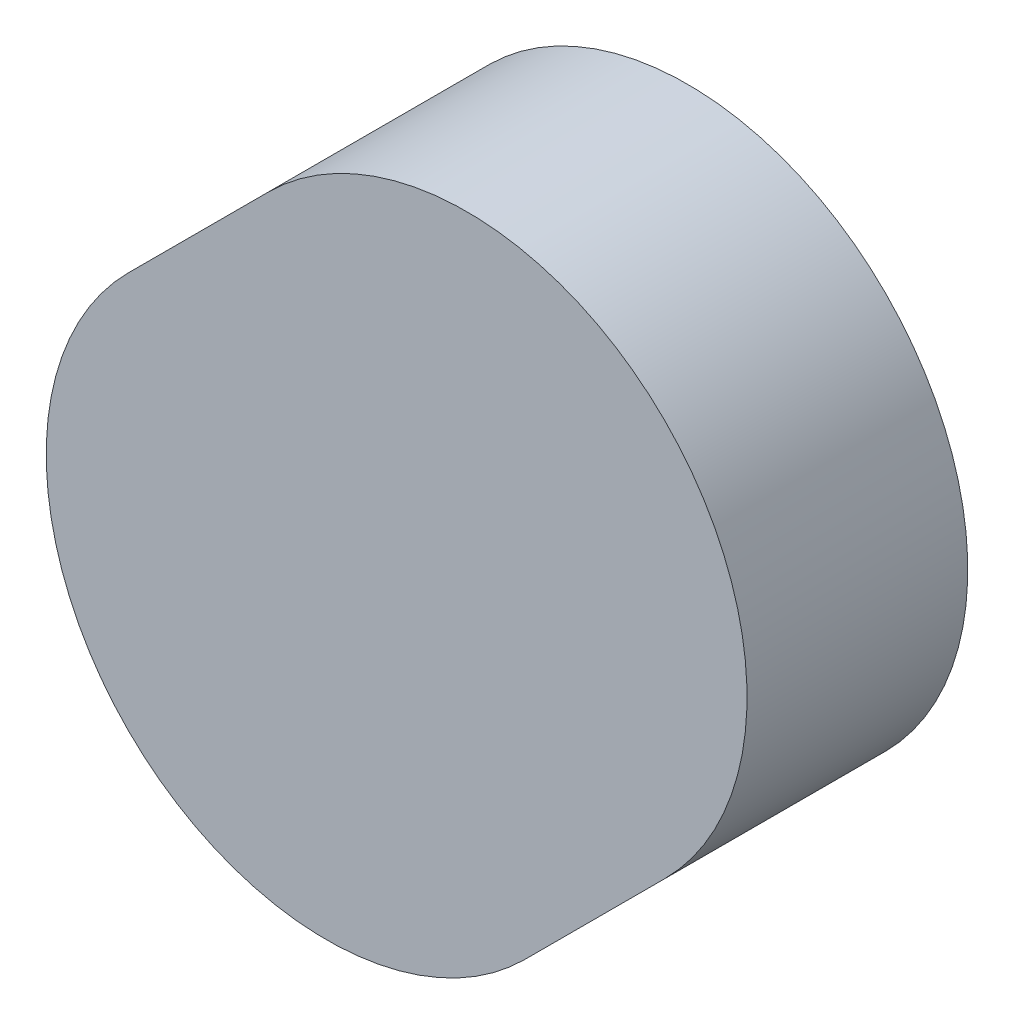
ISO-10303-21;
HEADER;
FILE_DESCRIPTION(('STEP AP214'),'2;1');
FILE_NAME('part.step','',(''),(''),'','','');
FILE_SCHEMA(('AUTOMOTIVE_DESIGN { 1 0 10303 214 1 1 1 1 }'));
ENDSEC;
DATA;
#1=APPLICATION_CONTEXT('core data for automotive mechanical design processes');
#2=APPLICATION_PROTOCOL_DEFINITION('international standard','automotive_design',2000,#1);
#3=PRODUCT_CONTEXT('',#1,'mechanical');
#4=PRODUCT('Part','Part','',(#3));
#5=PRODUCT_RELATED_PRODUCT_CATEGORY('part','',(#4));
#6=PRODUCT_DEFINITION_FORMATION('','',#4);
#7=PRODUCT_DEFINITION_CONTEXT('part definition',#1,'design');
#8=PRODUCT_DEFINITION('design','',#6,#7);
#9=PRODUCT_DEFINITION_SHAPE('','',#8);
#10=(LENGTH_UNIT() NAMED_UNIT(*) SI_UNIT(.MILLI.,.METRE.));
#11=(NAMED_UNIT(*) PLANE_ANGLE_UNIT() SI_UNIT($,.RADIAN.));
#12=(NAMED_UNIT(*) SI_UNIT($,.STERADIAN.) SOLID_ANGLE_UNIT());
#13=UNCERTAINTY_MEASURE_WITH_UNIT(LENGTH_MEASURE(1.E-05),#10,'distance_accuracy_value','');
#14=(GEOMETRIC_REPRESENTATION_CONTEXT(3) GLOBAL_UNCERTAINTY_ASSIGNED_CONTEXT((#13)) GLOBAL_UNIT_ASSIGNED_CONTEXT((#10,
#11,#12)) REPRESENTATION_CONTEXT('',''));
#15=CARTESIAN_POINT('',(0.,0.,0.));
#16=DIRECTION('',(0.,0.,1.));
#17=DIRECTION('',(1.,0.,0.));
#18=AXIS2_PLACEMENT_3D('',#15,#16,#17);
#19=CARTESIAN_POINT('',(150.54760594,102.75202716,0.));
#20=DIRECTION('',(-0.707106781186508,0.707106781186587,0.));
#21=DIRECTION('',(0.707106781186587,0.707106781186508,0.));
#22=AXIS2_PLACEMENT_3D('',#19,#20,#21);
#23=PLANE('',#22);
#24=DIRECTION('',(0.707106781186587,0.707106781186508,0.));
#25=VECTOR('',#24,1.);
#26=CARTESIAN_POINT('',(150.54760594,102.75202716,0.1999996));
#27=LINE('',#26,#25);
#28=CARTESIAN_POINT('',(150.54760594,102.75202716,0.1999996));
#29=VERTEX_POINT('',#28);
#30=CARTESIAN_POINT('',(150.6746034,102.87902462,0.1999996));
#31=VERTEX_POINT('',#30);
#32=EDGE_CURVE('E11',#29,#31,#27,.T.);
#33=ORIENTED_EDGE('',*,*,#32,.F.);
#34=DIRECTION('',(0.,0.,1.));
#35=VECTOR('',#34,1.);
#36=CARTESIAN_POINT('',(150.54760594,102.75202716,0.));
#37=LINE('',#36,#35);
#38=CARTESIAN_POINT('',(150.54760594,102.75202716,0.));
#39=VERTEX_POINT('',#38);
#40=EDGE_CURVE('E24',#39,#29,#37,.T.);
#41=ORIENTED_EDGE('',*,*,#40,.F.);
#42=DIRECTION('',(0.707106781186587,0.707106781186508,0.));
#43=VECTOR('',#42,1.);
#44=CARTESIAN_POINT('',(150.54760594,102.75202716,0.));
#45=LINE('',#44,#43);
#46=CARTESIAN_POINT('',(150.6746034,102.87902462,0.));
#47=VERTEX_POINT('',#46);
#48=EDGE_CURVE('E75',#39,#47,#45,.T.);
#49=ORIENTED_EDGE('',*,*,#48,.T.);
#50=DIRECTION('',(0.,0.,1.));
#51=VECTOR('',#50,1.);
#52=CARTESIAN_POINT('',(150.6746034,102.87902462,0.));
#53=LINE('',#52,#51);
#54=EDGE_CURVE('E37',#47,#31,#53,.T.);
#55=ORIENTED_EDGE('',*,*,#54,.T.);
#56=EDGE_LOOP('',(#33,#41,#49,#55));
#57=FACE_BOUND('',#56,.T.);
#58=ADVANCED_FACE('F17',(#57),#23,.F.);
#59=CARTESIAN_POINT('',(150.49499873,103.05862929,0.));
#60=DIRECTION('',(0.,0.,-1.));
#61=DIRECTION('',(0.707106781186548,-0.707106781186548,0.));
#62=AXIS2_PLACEMENT_3D('',#59,#60,#61);
#63=CYLINDRICAL_SURFACE('',#62,0.253999360179542);
#64=CARTESIAN_POINT('',(150.49499873,103.05862929,0.1999996));
#65=DIRECTION('',(0.,0.,1.));
#66=DIRECTION('',(0.707106781186548,-0.707106781186548,0.));
#67=AXIS2_PLACEMENT_3D('',#64,#65,#66);
#68=CIRCLE('',#67,0.253999360179542);
#69=CARTESIAN_POINT('',(150.31539406,103.23823396,0.1999996));
#70=VERTEX_POINT('',#69);
#71=EDGE_CURVE('E83',#31,#70,#68,.T.);
#72=ORIENTED_EDGE('',*,*,#71,.F.);
#73=ORIENTED_EDGE('',*,*,#54,.F.);
#74=CARTESIAN_POINT('',(150.49499873,103.05862929,0.));
#75=DIRECTION('',(0.,0.,1.));
#76=DIRECTION('',(0.707106781186548,-0.707106781186548,0.));
#77=AXIS2_PLACEMENT_3D('',#74,#75,#76);
#78=CIRCLE('',#77,0.253999360179542);
#79=CARTESIAN_POINT('',(150.31539406,103.23823396,0.));
#80=VERTEX_POINT('',#79);
#81=EDGE_CURVE('E81',#47,#80,#78,.T.);
#82=ORIENTED_EDGE('',*,*,#81,.T.);
#83=DIRECTION('',(0.,0.,1.));
#84=VECTOR('',#83,1.);
#85=CARTESIAN_POINT('',(150.31539406,103.23823396,0.));
#86=LINE('',#85,#84);
#87=EDGE_CURVE('E67',#80,#70,#86,.T.);
#88=ORIENTED_EDGE('',*,*,#87,.T.);
#89=EDGE_LOOP('',(#72,#73,#82,#88));
#90=FACE_BOUND('',#89,.T.);
#91=ADVANCED_FACE('F89',(#90),#63,.T.);
#92=CARTESIAN_POINT('',(150.31539406,103.23823396,0.));
#93=DIRECTION('',(0.707106781186548,-0.707106781186548,0.));
#94=DIRECTION('',(-0.707106781186548,-0.707106781186548,0.));
#95=AXIS2_PLACEMENT_3D('',#92,#93,#94);
#96=PLANE('',#95);
#97=DIRECTION('',(-0.707106781186548,-0.707106781186548,0.));
#98=VECTOR('',#97,1.);
#99=CARTESIAN_POINT('',(150.31539406,103.23823396,0.1999996));
#100=LINE('',#99,#98);
#101=CARTESIAN_POINT('',(150.1883966,103.1112365,0.1999996));
#102=VERTEX_POINT('',#101);
#103=EDGE_CURVE('E71',#70,#102,#100,.T.);
#104=ORIENTED_EDGE('',*,*,#103,.F.);
#105=ORIENTED_EDGE('',*,*,#87,.F.);
#106=DIRECTION('',(-0.707106781186548,-0.707106781186548,0.));
#107=VECTOR('',#106,1.);
#108=CARTESIAN_POINT('',(150.31539406,103.23823396,0.));
#109=LINE('',#108,#107);
#110=CARTESIAN_POINT('',(150.1883966,103.1112365,0.));
#111=VERTEX_POINT('',#110);
#112=EDGE_CURVE('E63',#80,#111,#109,.T.);
#113=ORIENTED_EDGE('',*,*,#112,.T.);
#114=DIRECTION('',(0.,0.,1.));
#115=VECTOR('',#114,1.);
#116=CARTESIAN_POINT('',(150.1883966,103.1112365,0.));
#117=LINE('',#116,#115);
#118=EDGE_CURVE('E53',#111,#102,#117,.T.);
#119=ORIENTED_EDGE('',*,*,#118,.T.);
#120=EDGE_LOOP('',(#104,#105,#113,#119));
#121=FACE_BOUND('',#120,.T.);
#122=ADVANCED_FACE('F66',(#121),#96,.F.);
#123=CARTESIAN_POINT('',(150.36800127,102.93163183,0.));
#124=DIRECTION('',(0.,0.,-1.));
#125=DIRECTION('',(-0.707106781186492,0.707106781186603,0.));
#126=AXIS2_PLACEMENT_3D('',#123,#124,#125);
#127=CYLINDRICAL_SURFACE('',#126,0.253999360179536);
#128=CARTESIAN_POINT('',(150.36800127,102.93163183,0.1999996));
#129=DIRECTION('',(0.,0.,1.));
#130=DIRECTION('',(-0.707106781186492,0.707106781186603,0.));
#131=AXIS2_PLACEMENT_3D('',#128,#129,#130);
#132=CIRCLE('',#131,0.253999360179536);
#133=EDGE_CURVE('E59',#102,#29,#132,.T.);
#134=ORIENTED_EDGE('',*,*,#133,.F.);
#135=ORIENTED_EDGE('',*,*,#118,.F.);
#136=CARTESIAN_POINT('',(150.36800127,102.93163183,0.));
#137=DIRECTION('',(0.,0.,1.));
#138=DIRECTION('',(-0.707106781186492,0.707106781186603,0.));
#139=AXIS2_PLACEMENT_3D('',#136,#137,#138);
#140=CIRCLE('',#139,0.253999360179536);
#141=EDGE_CURVE('E57',#111,#39,#140,.T.);
#142=ORIENTED_EDGE('',*,*,#141,.T.);
#143=ORIENTED_EDGE('',*,*,#40,.T.);
#144=EDGE_LOOP('',(#134,#135,#142,#143));
#145=FACE_BOUND('',#144,.T.);
#146=ADVANCED_FACE('F55',(#145),#127,.T.);
#147=CARTESIAN_POINT('',(150.54760594,102.75202716,0.));
#148=DIRECTION('',(0.,0.,-1.));
#149=DIRECTION('',(-1.,0.,0.));
#150=AXIS2_PLACEMENT_3D('',#147,#148,#149);
#151=PLANE('',#150);
#152=ORIENTED_EDGE('',*,*,#141,.F.);
#153=ORIENTED_EDGE('',*,*,#112,.F.);
#154=ORIENTED_EDGE('',*,*,#81,.F.);
#155=ORIENTED_EDGE('',*,*,#48,.F.);
#156=EDGE_LOOP('',(#152,#153,#154,#155));
#157=FACE_BOUND('',#156,.T.);
#158=ADVANCED_FACE('F74',(#157),#151,.T.);
#159=CARTESIAN_POINT('',(150.54760594,102.75202716,0.1999996));
#160=DIRECTION('',(0.,0.,-1.));
#161=DIRECTION('',(-1.,0.,0.));
#162=AXIS2_PLACEMENT_3D('',#159,#160,#161);
#163=PLANE('',#162);
#164=ORIENTED_EDGE('',*,*,#32,.T.);
#165=ORIENTED_EDGE('',*,*,#71,.T.);
#166=ORIENTED_EDGE('',*,*,#103,.T.);
#167=ORIENTED_EDGE('',*,*,#133,.T.);
#168=EDGE_LOOP('',(#164,#165,#166,#167));
#169=FACE_BOUND('',#168,.T.);
#170=ADVANCED_FACE('F91',(#169),#163,.F.);
#171=CLOSED_SHELL('',(#58,#91,#122,#146,#158,#170));
#172=MANIFOLD_SOLID_BREP('B1',#171);
#173=ADVANCED_BREP_SHAPE_REPRESENTATION('',(#18,#172),#14);
#174=SHAPE_DEFINITION_REPRESENTATION(#9,#173);
ENDSEC;
END-ISO-10303-21;
